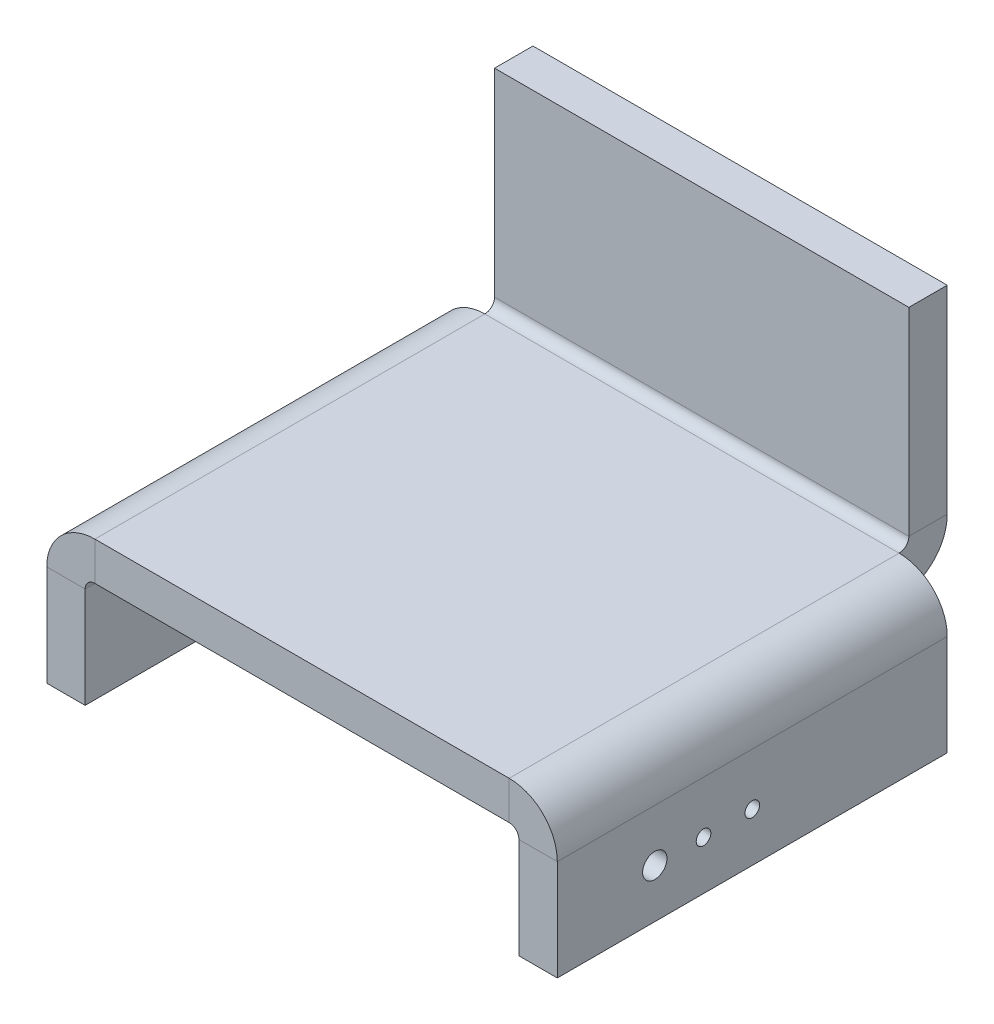
ISO-10303-21;
HEADER;
FILE_DESCRIPTION(('STEP AP214'),'2;1');
FILE_NAME('part.step','',(''),(''),'','','');
FILE_SCHEMA(('AUTOMOTIVE_DESIGN { 1 0 10303 214 1 1 1 1 }'));
ENDSEC;
DATA;
#1=APPLICATION_CONTEXT('core data for automotive mechanical design processes');
#2=APPLICATION_PROTOCOL_DEFINITION('international standard','automotive_design',2000,#1);
#3=PRODUCT_CONTEXT('',#1,'mechanical');
#4=PRODUCT('Part','Part','',(#3));
#5=PRODUCT_RELATED_PRODUCT_CATEGORY('part','',(#4));
#6=PRODUCT_DEFINITION_FORMATION('','',#4);
#7=PRODUCT_DEFINITION_CONTEXT('part definition',#1,'design');
#8=PRODUCT_DEFINITION('design','',#6,#7);
#9=PRODUCT_DEFINITION_SHAPE('','',#8);
#10=(LENGTH_UNIT() NAMED_UNIT(*) SI_UNIT(.MILLI.,.METRE.));
#11=(NAMED_UNIT(*) PLANE_ANGLE_UNIT() SI_UNIT($,.RADIAN.));
#12=(NAMED_UNIT(*) SI_UNIT($,.STERADIAN.) SOLID_ANGLE_UNIT());
#13=UNCERTAINTY_MEASURE_WITH_UNIT(LENGTH_MEASURE(1.E-05),#10,'distance_accuracy_value','');
#14=(GEOMETRIC_REPRESENTATION_CONTEXT(3) GLOBAL_UNCERTAINTY_ASSIGNED_CONTEXT((#13)) GLOBAL_UNIT_ASSIGNED_CONTEXT((#10,
#11,#12)) REPRESENTATION_CONTEXT('',''));
#15=CARTESIAN_POINT('',(0.,0.,0.));
#16=DIRECTION('',(0.,0.,1.));
#17=DIRECTION('',(1.,0.,0.));
#18=AXIS2_PLACEMENT_3D('',#15,#16,#17);
#19=CARTESIAN_POINT('',(0.,-7.6378,0.));
#20=DIRECTION('',(0.,-1.,0.));
#21=DIRECTION('',(0.,0.,-1.));
#22=AXIS2_PLACEMENT_3D('',#19,#20,#21);
#23=PLANE('',#22);
#24=DIRECTION('',(0.,0.,1.));
#25=VECTOR('',#24,1.);
#26=CARTESIAN_POINT('',(38.1,-7.6378,0.));
#27=LINE('',#26,#25);
#28=CARTESIAN_POINT('',(38.1,-7.6378,-101.6));
#29=VERTEX_POINT('',#28);
#30=CARTESIAN_POINT('',(38.1,-7.6378,0.));
#31=VERTEX_POINT('',#30);
#32=EDGE_CURVE('E65',#29,#31,#27,.T.);
#33=ORIENTED_EDGE('',*,*,#32,.F.);
#34=DIRECTION('',(1.,0.,0.));
#35=VECTOR('',#34,1.);
#36=CARTESIAN_POINT('',(0.,-7.6378,-101.6));
#37=LINE('',#36,#35);
#38=CARTESIAN_POINT('',(146.05,-7.6378,-101.6));
#39=VERTEX_POINT('',#38);
#40=EDGE_CURVE('E57',#29,#39,#37,.T.);
#41=ORIENTED_EDGE('',*,*,#40,.T.);
#42=DIRECTION('',(0.,0.,1.));
#43=VECTOR('',#42,1.);
#44=CARTESIAN_POINT('',(146.05,-7.6378,0.));
#45=LINE('',#44,#43);
#46=CARTESIAN_POINT('',(146.05,-7.6378,0.));
#47=VERTEX_POINT('',#46);
#48=EDGE_CURVE('E309',#39,#47,#45,.T.);
#49=ORIENTED_EDGE('',*,*,#48,.T.);
#50=DIRECTION('',(1.,0.,0.));
#51=VECTOR('',#50,1.);
#52=CARTESIAN_POINT('',(0.,-7.6378,0.));
#53=LINE('',#52,#51);
#54=EDGE_CURVE('E290',#31,#47,#53,.T.);
#55=ORIENTED_EDGE('',*,*,#54,.F.);
#56=EDGE_LOOP('',(#33,#41,#49,#55));
#57=FACE_BOUND('',#56,.T.);
#58=ADVANCED_FACE('F49',(#57),#23,.T.);
#59=CARTESIAN_POINT('',(0.,2.3622,0.));
#60=DIRECTION('',(0.,0.,-1.));
#61=DIRECTION('',(1.,0.,0.));
#62=AXIS2_PLACEMENT_3D('',#59,#60,#61);
#63=PLANE('',#62);
#64=ORIENTED_EDGE('',*,*,#54,.T.);
#65=DIRECTION('',(0.,1.,0.));
#66=VECTOR('',#65,1.);
#67=CARTESIAN_POINT('',(146.05,2.3622,0.));
#68=LINE('',#67,#66);
#69=CARTESIAN_POINT('',(146.05,2.3622,0.));
#70=VERTEX_POINT('',#69);
#71=EDGE_CURVE('E306',#47,#70,#68,.T.);
#72=ORIENTED_EDGE('',*,*,#71,.T.);
#73=DIRECTION('',(1.,0.,0.));
#74=VECTOR('',#73,1.);
#75=CARTESIAN_POINT('',(0.,2.3622,0.));
#76=LINE('',#75,#74);
#77=CARTESIAN_POINT('',(38.1,2.3622,0.));
#78=VERTEX_POINT('',#77);
#79=EDGE_CURVE('E298',#78,#70,#76,.T.);
#80=ORIENTED_EDGE('',*,*,#79,.F.);
#81=DIRECTION('',(0.,1.,0.));
#82=VECTOR('',#81,1.);
#83=CARTESIAN_POINT('',(38.1,2.3622,0.));
#84=LINE('',#83,#82);
#85=EDGE_CURVE('E300',#31,#78,#84,.T.);
#86=ORIENTED_EDGE('',*,*,#85,.F.);
#87=EDGE_LOOP('',(#64,#72,#80,#86));
#88=FACE_BOUND('',#87,.T.);
#89=ADVANCED_FACE('F430',(#88),#63,.F.);
#90=CARTESIAN_POINT('',(0.,2.3622,0.));
#91=DIRECTION('',(0.,-1.,0.));
#92=DIRECTION('',(0.,0.,-1.));
#93=AXIS2_PLACEMENT_3D('',#90,#91,#92);
#94=PLANE('',#93);
#95=DIRECTION('',(1.,0.,0.));
#96=VECTOR('',#95,1.);
#97=CARTESIAN_POINT('',(0.,2.3622,-101.6));
#98=LINE('',#97,#96);
#99=CARTESIAN_POINT('',(38.1,2.3622,-101.6));
#100=VERTEX_POINT('',#99);
#101=CARTESIAN_POINT('',(146.05,2.3622,-101.6));
#102=VERTEX_POINT('',#101);
#103=EDGE_CURVE('E312',#100,#102,#98,.T.);
#104=ORIENTED_EDGE('',*,*,#103,.F.);
#105=DIRECTION('',(0.,0.,1.));
#106=VECTOR('',#105,1.);
#107=CARTESIAN_POINT('',(38.1,2.3622,0.));
#108=LINE('',#107,#106);
#109=EDGE_CURVE('E295',#100,#78,#108,.T.);
#110=ORIENTED_EDGE('',*,*,#109,.T.);
#111=ORIENTED_EDGE('',*,*,#79,.T.);
#112=DIRECTION('',(0.,0.,1.));
#113=VECTOR('',#112,1.);
#114=CARTESIAN_POINT('',(146.05,2.3622,0.));
#115=LINE('',#114,#113);
#116=EDGE_CURVE('E303',#102,#70,#115,.T.);
#117=ORIENTED_EDGE('',*,*,#116,.F.);
#118=EDGE_LOOP('',(#104,#110,#111,#117));
#119=FACE_BOUND('',#118,.T.);
#120=ADVANCED_FACE('F391',(#119),#94,.F.);
#121=CARTESIAN_POINT('',(38.1,-10.1778,-101.6));
#122=DIRECTION('',(0.,0.,-1.));
#123=DIRECTION('',(-1.,0.,0.));
#124=AXIS2_PLACEMENT_3D('',#121,#122,#123);
#125=PLANE('',#124);
#126=DIRECTION('',(0.,1.,0.));
#127=VECTOR('',#126,1.);
#128=CARTESIAN_POINT('',(38.1,2.3622,-101.6));
#129=LINE('',#128,#127);
#130=EDGE_CURVE('E12',#29,#100,#129,.T.);
#131=ORIENTED_EDGE('',*,*,#130,.F.);
#132=CARTESIAN_POINT('',(38.1,-10.1778,-101.6));
#133=DIRECTION('',(0.,0.,1.));
#134=DIRECTION('',(1.,0.,0.));
#135=AXIS2_PLACEMENT_3D('',#132,#133,#134);
#136=CIRCLE('',#135,2.54);
#137=CARTESIAN_POINT('',(35.56,-10.1778,-101.6));
#138=VERTEX_POINT('',#137);
#139=EDGE_CURVE('E254',#29,#138,#136,.T.);
#140=ORIENTED_EDGE('',*,*,#139,.T.);
#141=DIRECTION('',(1.,0.,0.));
#142=VECTOR('',#141,1.);
#143=CARTESIAN_POINT('',(25.56,-10.1778,-101.6));
#144=LINE('',#143,#142);
#145=CARTESIAN_POINT('',(25.56,-10.1778,-101.6));
#146=VERTEX_POINT('',#145);
#147=EDGE_CURVE('E265',#146,#138,#144,.T.);
#148=ORIENTED_EDGE('',*,*,#147,.F.);
#149=CARTESIAN_POINT('',(38.1,-10.1778,-101.6));
#150=DIRECTION('',(0.,0.,1.));
#151=DIRECTION('',(1.,0.,0.));
#152=AXIS2_PLACEMENT_3D('',#149,#150,#151);
#153=CIRCLE('',#152,12.54);
#154=EDGE_CURVE('E283',#100,#146,#153,.T.);
#155=ORIENTED_EDGE('',*,*,#154,.F.);
#156=EDGE_LOOP('',(#131,#140,#148,#155));
#157=FACE_BOUND('',#156,.T.);
#158=ADVANCED_FACE('F378',(#157),#125,.T.);
#159=CARTESIAN_POINT('',(38.1,-10.1778,0.));
#160=DIRECTION('',(0.,0.,1.));
#161=DIRECTION('',(1.,0.,0.));
#162=AXIS2_PLACEMENT_3D('',#159,#160,#161);
#163=PLANE('',#162);
#164=DIRECTION('',(-1.,0.,0.));
#165=VECTOR('',#164,1.);
#166=CARTESIAN_POINT('',(25.56,-10.1778,0.));
#167=LINE('',#166,#165);
#168=CARTESIAN_POINT('',(35.56,-10.1778,0.));
#169=VERTEX_POINT('',#168);
#170=CARTESIAN_POINT('',(25.56,-10.1778,0.));
#171=VERTEX_POINT('',#170);
#172=EDGE_CURVE('E252',#169,#171,#167,.T.);
#173=ORIENTED_EDGE('',*,*,#172,.F.);
#174=CARTESIAN_POINT('',(38.1,-10.1778,0.));
#175=DIRECTION('',(0.,0.,1.));
#176=DIRECTION('',(1.,0.,0.));
#177=AXIS2_PLACEMENT_3D('',#174,#175,#176);
#178=CIRCLE('',#177,2.54);
#179=EDGE_CURVE('E287',#169,#31,#178,.F.);
#180=ORIENTED_EDGE('',*,*,#179,.T.);
#181=ORIENTED_EDGE('',*,*,#85,.T.);
#182=CARTESIAN_POINT('',(38.1,-10.1778,0.));
#183=DIRECTION('',(0.,0.,-1.));
#184=DIRECTION('',(-1.,0.,0.));
#185=AXIS2_PLACEMENT_3D('',#182,#183,#184);
#186=CIRCLE('',#185,12.54);
#187=EDGE_CURVE('E286',#171,#78,#186,.T.);
#188=ORIENTED_EDGE('',*,*,#187,.F.);
#189=EDGE_LOOP('',(#173,#180,#181,#188));
#190=FACE_BOUND('',#189,.T.);
#191=ADVANCED_FACE('F442',(#190),#163,.T.);
#192=CARTESIAN_POINT('',(38.1,-10.1778,-153.57565713919));
#193=DIRECTION('',(0.,0.,1.));
#194=DIRECTION('',(1.,0.,0.));
#195=AXIS2_PLACEMENT_3D('',#192,#193,#194);
#196=CYLINDRICAL_SURFACE('',#195,12.54);
#197=ORIENTED_EDGE('',*,*,#187,.T.);
#198=ORIENTED_EDGE('',*,*,#109,.F.);
#199=ORIENTED_EDGE('',*,*,#154,.T.);
#200=DIRECTION('',(0.,0.,1.));
#201=VECTOR('',#200,1.);
#202=CARTESIAN_POINT('',(25.56,-10.1778,0.));
#203=LINE('',#202,#201);
#204=EDGE_CURVE('E248',#146,#171,#203,.T.);
#205=ORIENTED_EDGE('',*,*,#204,.T.);
#206=EDGE_LOOP('',(#197,#198,#199,#205));
#207=FACE_BOUND('',#206,.T.);
#208=ADVANCED_FACE('F445',(#207),#196,.T.);
#209=CARTESIAN_POINT('',(38.1,-10.1778,-153.57565713919));
#210=DIRECTION('',(0.,0.,1.));
#211=DIRECTION('',(1.,0.,0.));
#212=AXIS2_PLACEMENT_3D('',#209,#210,#211);
#213=CYLINDRICAL_SURFACE('',#212,2.54);
#214=ORIENTED_EDGE('',*,*,#179,.F.);
#215=DIRECTION('',(0.,0.,1.));
#216=VECTOR('',#215,1.);
#217=CARTESIAN_POINT('',(35.56,-10.1778,0.));
#218=LINE('',#217,#216);
#219=EDGE_CURVE('E257',#138,#169,#218,.T.);
#220=ORIENTED_EDGE('',*,*,#219,.F.);
#221=ORIENTED_EDGE('',*,*,#139,.F.);
#222=ORIENTED_EDGE('',*,*,#32,.T.);
#223=EDGE_LOOP('',(#214,#220,#221,#222));
#224=FACE_BOUND('',#223,.T.);
#225=ADVANCED_FACE('F447',(#224),#213,.F.);
#226=CARTESIAN_POINT('',(25.5600000000001,-36.4339956959665,0.));
#227=DIRECTION('',(0.,1.,0.));
#228=DIRECTION('',(0.,0.,1.));
#229=AXIS2_PLACEMENT_3D('',#226,#227,#228);
#230=PLANE('',#229);
#231=DIRECTION('',(-1.,0.,0.));
#232=VECTOR('',#231,1.);
#233=CARTESIAN_POINT('',(25.5600000000001,-36.4339956959665,-101.6));
#234=LINE('',#233,#232);
#235=CARTESIAN_POINT('',(35.5600000000001,-36.4339956959665,-101.6));
#236=VERTEX_POINT('',#235);
#237=CARTESIAN_POINT('',(25.5600000000001,-36.4339956959665,-101.6));
#238=VERTEX_POINT('',#237);
#239=EDGE_CURVE('E260',#236,#238,#234,.T.);
#240=ORIENTED_EDGE('',*,*,#239,.F.);
#241=DIRECTION('',(0.,0.,-1.));
#242=VECTOR('',#241,1.);
#243=CARTESIAN_POINT('',(35.5600000000001,-36.4339956959665,0.));
#244=LINE('',#243,#242);
#245=CARTESIAN_POINT('',(35.5600000000001,-36.4339956959665,0.));
#246=VERTEX_POINT('',#245);
#247=EDGE_CURVE('E278',#236,#246,#244,.F.);
#248=ORIENTED_EDGE('',*,*,#247,.T.);
#249=DIRECTION('',(-1.,0.,0.));
#250=VECTOR('',#249,1.);
#251=CARTESIAN_POINT('',(25.5600000000001,-36.4339956959665,0.));
#252=LINE('',#251,#250);
#253=CARTESIAN_POINT('',(25.5600000000001,-36.4339956959665,0.));
#254=VERTEX_POINT('',#253);
#255=EDGE_CURVE('E276',#246,#254,#252,.T.);
#256=ORIENTED_EDGE('',*,*,#255,.T.);
#257=DIRECTION('',(0.,0.,1.));
#258=VECTOR('',#257,1.);
#259=CARTESIAN_POINT('',(25.5600000000001,-36.4339956959665,0.));
#260=LINE('',#259,#258);
#261=EDGE_CURVE('E271',#238,#254,#260,.T.);
#262=ORIENTED_EDGE('',*,*,#261,.F.);
#263=EDGE_LOOP('',(#240,#248,#256,#262));
#264=FACE_BOUND('',#263,.T.);
#265=ADVANCED_FACE('F450',(#264),#230,.F.);
#266=CARTESIAN_POINT('',(25.5600000000001,-36.4339956959665,0.));
#267=DIRECTION('',(1.,0.,0.));
#268=DIRECTION('',(0.,0.,-1.));
#269=AXIS2_PLACEMENT_3D('',#266,#267,#268);
#270=PLANE('',#269);
#271=CARTESIAN_POINT('',(25.5599999999997,-23.7339956959661,-38.1));
#272=DIRECTION('',(1.,0.,0.));
#273=DIRECTION('',(0.,1.,0.));
#274=AXIS2_PLACEMENT_3D('',#271,#272,#273);
#275=CIRCLE('',#274,1.905);
#276=CARTESIAN_POINT('',(25.5599999999997,-21.8289956959661,-38.1));
#277=VERTEX_POINT('',#276);
#278=EDGE_CURVE('E326',#277,#277,#275,.T.);
#279=ORIENTED_EDGE('',*,*,#278,.T.);
#280=EDGE_LOOP('',(#279));
#281=FACE_BOUND('',#280,.T.);
#282=CARTESIAN_POINT('',(25.5599999999997,-23.7339956959661,-50.8));
#283=DIRECTION('',(1.,0.,0.));
#284=DIRECTION('',(0.,1.,0.));
#285=AXIS2_PLACEMENT_3D('',#282,#283,#284);
#286=CIRCLE('',#285,1.905);
#287=CARTESIAN_POINT('',(25.5599999999997,-21.8289956959661,-50.8));
#288=VERTEX_POINT('',#287);
#289=EDGE_CURVE('E337',#288,#288,#286,.T.);
#290=ORIENTED_EDGE('',*,*,#289,.T.);
#291=EDGE_LOOP('',(#290));
#292=FACE_BOUND('',#291,.T.);
#293=CARTESIAN_POINT('',(25.5599999999997,-23.7339956959661,-25.4));
#294=DIRECTION('',(1.,0.,0.));
#295=DIRECTION('',(0.,1.,0.));
#296=AXIS2_PLACEMENT_3D('',#293,#294,#295);
#297=CIRCLE('',#296,3.175);
#298=CARTESIAN_POINT('',(25.5599999999997,-20.5589956959661,-25.4));
#299=VERTEX_POINT('',#298);
#300=EDGE_CURVE('E322',#299,#299,#297,.T.);
#301=ORIENTED_EDGE('',*,*,#300,.T.);
#302=EDGE_LOOP('',(#301));
#303=FACE_BOUND('',#302,.T.);
#304=ORIENTED_EDGE('',*,*,#204,.F.);
#305=DIRECTION('',(0.,-1.,0.));
#306=VECTOR('',#305,1.);
#307=CARTESIAN_POINT('',(25.5600000000001,-36.4339956959665,-101.6));
#308=LINE('',#307,#306);
#309=EDGE_CURVE('E274',#146,#238,#308,.T.);
#310=ORIENTED_EDGE('',*,*,#309,.T.);
#311=ORIENTED_EDGE('',*,*,#261,.T.);
#312=DIRECTION('',(0.,1.,0.));
#313=VECTOR('',#312,1.);
#314=CARTESIAN_POINT('',(25.5600000000001,-36.4339956959665,0.));
#315=LINE('',#314,#313);
#316=EDGE_CURVE('E268',#254,#171,#315,.T.);
#317=ORIENTED_EDGE('',*,*,#316,.T.);
#318=EDGE_LOOP('',(#304,#310,#311,#317));
#319=FACE_BOUND('',#318,.T.);
#320=ADVANCED_FACE('F466',(#281,#292,#303,#319),#270,.F.);
#321=CARTESIAN_POINT('',(25.5600000000001,-36.4339956959665,-101.6));
#322=DIRECTION('',(0.,0.,1.));
#323=DIRECTION('',(0.,-1.,0.));
#324=AXIS2_PLACEMENT_3D('',#321,#322,#323);
#325=PLANE('',#324);
#326=ORIENTED_EDGE('',*,*,#309,.F.);
#327=ORIENTED_EDGE('',*,*,#147,.T.);
#328=DIRECTION('',(0.,1.,0.));
#329=VECTOR('',#328,1.);
#330=CARTESIAN_POINT('',(35.5600000000001,-36.4339956959665,-101.6));
#331=LINE('',#330,#329);
#332=EDGE_CURVE('E263',#138,#236,#331,.F.);
#333=ORIENTED_EDGE('',*,*,#332,.T.);
#334=ORIENTED_EDGE('',*,*,#239,.T.);
#335=EDGE_LOOP('',(#326,#327,#333,#334));
#336=FACE_BOUND('',#335,.T.);
#337=ADVANCED_FACE('F462',(#336),#325,.F.);
#338=CARTESIAN_POINT('',(35.5600000000001,-36.4339956959665,0.));
#339=DIRECTION('',(1.,0.,0.));
#340=DIRECTION('',(0.,0.,-1.));
#341=AXIS2_PLACEMENT_3D('',#338,#339,#340);
#342=PLANE('',#341);
#343=CARTESIAN_POINT('',(35.5600000000001,-23.7339956959661,-38.1));
#344=DIRECTION('',(1.,0.,0.));
#345=DIRECTION('',(0.,1.,0.));
#346=AXIS2_PLACEMENT_3D('',#343,#344,#345);
#347=CIRCLE('',#346,1.905);
#348=CARTESIAN_POINT('',(35.56,-21.8289956959661,-38.1));
#349=VERTEX_POINT('',#348);
#350=EDGE_CURVE('E345',#349,#349,#347,.T.);
#351=ORIENTED_EDGE('',*,*,#350,.F.);
#352=EDGE_LOOP('',(#351));
#353=FACE_BOUND('',#352,.T.);
#354=CARTESIAN_POINT('',(35.5600000000001,-23.7339956959661,-50.8));
#355=DIRECTION('',(1.,0.,0.));
#356=DIRECTION('',(0.,1.,0.));
#357=AXIS2_PLACEMENT_3D('',#354,#355,#356);
#358=CIRCLE('',#357,1.905);
#359=CARTESIAN_POINT('',(35.56,-21.8289956959661,-50.8));
#360=VERTEX_POINT('',#359);
#361=EDGE_CURVE('E325',#360,#360,#358,.T.);
#362=ORIENTED_EDGE('',*,*,#361,.F.);
#363=EDGE_LOOP('',(#362));
#364=FACE_BOUND('',#363,.T.);
#365=CARTESIAN_POINT('',(35.5600000000001,-23.7339956959661,-25.4));
#366=DIRECTION('',(1.,0.,0.));
#367=DIRECTION('',(0.,1.,0.));
#368=AXIS2_PLACEMENT_3D('',#365,#366,#367);
#369=CIRCLE('',#368,3.175);
#370=CARTESIAN_POINT('',(35.56,-20.5589956959661,-25.4));
#371=VERTEX_POINT('',#370);
#372=EDGE_CURVE('E199',#371,#371,#369,.T.);
#373=ORIENTED_EDGE('',*,*,#372,.F.);
#374=EDGE_LOOP('',(#373));
#375=FACE_BOUND('',#374,.T.);
#376=ORIENTED_EDGE('',*,*,#332,.F.);
#377=ORIENTED_EDGE('',*,*,#219,.T.);
#378=DIRECTION('',(0.,1.,0.));
#379=VECTOR('',#378,1.);
#380=CARTESIAN_POINT('',(35.5600000000001,-36.4339956959665,0.));
#381=LINE('',#380,#379);
#382=EDGE_CURVE('E255',#246,#169,#381,.T.);
#383=ORIENTED_EDGE('',*,*,#382,.F.);
#384=ORIENTED_EDGE('',*,*,#247,.F.);
#385=EDGE_LOOP('',(#376,#377,#383,#384));
#386=FACE_BOUND('',#385,.T.);
#387=ADVANCED_FACE('F458',(#353,#364,#375,#386),#342,.T.);
#388=CARTESIAN_POINT('',(25.5600000000001,-36.4339956959665,0.));
#389=DIRECTION('',(0.,0.,-1.));
#390=DIRECTION('',(0.,1.,0.));
#391=AXIS2_PLACEMENT_3D('',#388,#389,#390);
#392=PLANE('',#391);
#393=ORIENTED_EDGE('',*,*,#382,.T.);
#394=ORIENTED_EDGE('',*,*,#172,.T.);
#395=ORIENTED_EDGE('',*,*,#316,.F.);
#396=ORIENTED_EDGE('',*,*,#255,.F.);
#397=EDGE_LOOP('',(#393,#394,#395,#396));
#398=FACE_BOUND('',#397,.T.);
#399=ADVANCED_FACE('F455',(#398),#392,.F.);
#400=CARTESIAN_POINT('',(146.05,-10.1778,-101.6));
#401=DIRECTION('',(0.,0.,-1.));
#402=DIRECTION('',(-1.,0.,0.));
#403=AXIS2_PLACEMENT_3D('',#400,#401,#402);
#404=PLANE('',#403);
#405=DIRECTION('',(-1.,0.,0.));
#406=VECTOR('',#405,1.);
#407=CARTESIAN_POINT('',(158.59,-10.1778,-101.6));
#408=LINE('',#407,#406);
#409=CARTESIAN_POINT('',(158.59,-10.1778,-101.6));
#410=VERTEX_POINT('',#409);
#411=CARTESIAN_POINT('',(148.59,-10.1778,-101.6));
#412=VERTEX_POINT('',#411);
#413=EDGE_CURVE('E207',#410,#412,#408,.T.);
#414=ORIENTED_EDGE('',*,*,#413,.T.);
#415=CARTESIAN_POINT('',(146.05,-10.1778,-101.6));
#416=DIRECTION('',(0.,0.,-1.));
#417=DIRECTION('',(-1.,0.,0.));
#418=AXIS2_PLACEMENT_3D('',#415,#416,#417);
#419=CIRCLE('',#418,2.54);
#420=EDGE_CURVE('E73',#412,#39,#419,.F.);
#421=ORIENTED_EDGE('',*,*,#420,.T.);
#422=DIRECTION('',(0.,1.,0.));
#423=VECTOR('',#422,1.);
#424=CARTESIAN_POINT('',(146.05,2.3622,-101.6));
#425=LINE('',#424,#423);
#426=EDGE_CURVE('E317',#39,#102,#425,.T.);
#427=ORIENTED_EDGE('',*,*,#426,.T.);
#428=CARTESIAN_POINT('',(146.05,-10.1778,-101.6));
#429=DIRECTION('',(0.,0.,1.));
#430=DIRECTION('',(1.,0.,0.));
#431=AXIS2_PLACEMENT_3D('',#428,#429,#430);
#432=CIRCLE('',#431,12.54);
#433=EDGE_CURVE('E241',#410,#102,#432,.T.);
#434=ORIENTED_EDGE('',*,*,#433,.F.);
#435=EDGE_LOOP('',(#414,#421,#427,#434));
#436=FACE_BOUND('',#435,.T.);
#437=ADVANCED_FACE('F389',(#436),#404,.T.);
#438=CARTESIAN_POINT('',(146.05,-10.1778,0.));
#439=DIRECTION('',(0.,0.,1.));
#440=DIRECTION('',(1.,0.,0.));
#441=AXIS2_PLACEMENT_3D('',#438,#439,#440);
#442=PLANE('',#441);
#443=CARTESIAN_POINT('',(146.05,-10.1778,0.));
#444=DIRECTION('',(0.,0.,-1.));
#445=DIRECTION('',(-1.,0.,0.));
#446=AXIS2_PLACEMENT_3D('',#443,#444,#445);
#447=CIRCLE('',#446,2.54);
#448=CARTESIAN_POINT('',(148.59,-10.1778,0.));
#449=VERTEX_POINT('',#448);
#450=EDGE_CURVE('E245',#47,#449,#447,.T.);
#451=ORIENTED_EDGE('',*,*,#450,.T.);
#452=DIRECTION('',(1.,0.,0.));
#453=VECTOR('',#452,1.);
#454=CARTESIAN_POINT('',(158.59,-10.1778,0.));
#455=LINE('',#454,#453);
#456=CARTESIAN_POINT('',(158.59,-10.1778,0.));
#457=VERTEX_POINT('',#456);
#458=EDGE_CURVE('E234',#449,#457,#455,.T.);
#459=ORIENTED_EDGE('',*,*,#458,.T.);
#460=CARTESIAN_POINT('',(146.05,-10.1778,0.));
#461=DIRECTION('',(0.,0.,-1.));
#462=DIRECTION('',(-1.,0.,0.));
#463=AXIS2_PLACEMENT_3D('',#460,#461,#462);
#464=CIRCLE('',#463,12.54);
#465=EDGE_CURVE('E244',#70,#457,#464,.T.);
#466=ORIENTED_EDGE('',*,*,#465,.F.);
#467=ORIENTED_EDGE('',*,*,#71,.F.);
#468=EDGE_LOOP('',(#451,#459,#466,#467));
#469=FACE_BOUND('',#468,.T.);
#470=ADVANCED_FACE('F406',(#469),#442,.T.);
#471=CARTESIAN_POINT('',(146.05,-10.1778,51.9756571391896));
#472=DIRECTION('',(0.,0.,-1.));
#473=DIRECTION('',(-1.,0.,0.));
#474=AXIS2_PLACEMENT_3D('',#471,#472,#473);
#475=CYLINDRICAL_SURFACE('',#474,12.54);
#476=ORIENTED_EDGE('',*,*,#116,.T.);
#477=ORIENTED_EDGE('',*,*,#465,.T.);
#478=DIRECTION('',(0.,0.,1.));
#479=VECTOR('',#478,1.);
#480=CARTESIAN_POINT('',(158.59,-10.1778,0.));
#481=LINE('',#480,#479);
#482=EDGE_CURVE('E224',#410,#457,#481,.T.);
#483=ORIENTED_EDGE('',*,*,#482,.F.);
#484=ORIENTED_EDGE('',*,*,#433,.T.);
#485=EDGE_LOOP('',(#476,#477,#483,#484));
#486=FACE_BOUND('',#485,.T.);
#487=ADVANCED_FACE('F395',(#486),#475,.T.);
#488=CARTESIAN_POINT('',(146.05,-10.1778,51.9756571391896));
#489=DIRECTION('',(0.,0.,-1.));
#490=DIRECTION('',(-1.,0.,0.));
#491=AXIS2_PLACEMENT_3D('',#488,#489,#490);
#492=CYLINDRICAL_SURFACE('',#491,2.54);
#493=ORIENTED_EDGE('',*,*,#48,.F.);
#494=ORIENTED_EDGE('',*,*,#420,.F.);
#495=DIRECTION('',(0.,0.,1.));
#496=VECTOR('',#495,1.);
#497=CARTESIAN_POINT('',(148.59,-10.1778,0.));
#498=LINE('',#497,#496);
#499=EDGE_CURVE('E237',#412,#449,#498,.T.);
#500=ORIENTED_EDGE('',*,*,#499,.T.);
#501=ORIENTED_EDGE('',*,*,#450,.F.);
#502=EDGE_LOOP('',(#493,#494,#500,#501));
#503=FACE_BOUND('',#502,.T.);
#504=ADVANCED_FACE('F409',(#503),#492,.F.);
#505=CARTESIAN_POINT('',(158.59,-36.4339956959665,0.));
#506=DIRECTION('',(0.,1.,0.));
#507=DIRECTION('',(0.,0.,-1.));
#508=AXIS2_PLACEMENT_3D('',#505,#506,#507);
#509=PLANE('',#508);
#510=DIRECTION('',(1.,0.,0.));
#511=VECTOR('',#510,1.);
#512=CARTESIAN_POINT('',(158.59,-36.4339956959665,0.));
#513=LINE('',#512,#511);
#514=CARTESIAN_POINT('',(148.59,-36.4339956959665,0.));
#515=VERTEX_POINT('',#514);
#516=CARTESIAN_POINT('',(158.59,-36.4339956959665,0.));
#517=VERTEX_POINT('',#516);
#518=EDGE_CURVE('E214',#515,#517,#513,.T.);
#519=ORIENTED_EDGE('',*,*,#518,.F.);
#520=DIRECTION('',(0.,0.,-1.));
#521=VECTOR('',#520,1.);
#522=CARTESIAN_POINT('',(148.59,-36.4339956959665,0.));
#523=LINE('',#522,#521);
#524=CARTESIAN_POINT('',(148.59,-36.4339956959665,-101.6));
#525=VERTEX_POINT('',#524);
#526=EDGE_CURVE('E231',#515,#525,#523,.T.);
#527=ORIENTED_EDGE('',*,*,#526,.T.);
#528=DIRECTION('',(1.,0.,0.));
#529=VECTOR('',#528,1.);
#530=CARTESIAN_POINT('',(158.59,-36.4339956959665,-101.6));
#531=LINE('',#530,#529);
#532=CARTESIAN_POINT('',(158.59,-36.4339956959665,-101.6));
#533=VERTEX_POINT('',#532);
#534=EDGE_CURVE('E229',#525,#533,#531,.T.);
#535=ORIENTED_EDGE('',*,*,#534,.T.);
#536=DIRECTION('',(0.,0.,-1.));
#537=VECTOR('',#536,1.);
#538=CARTESIAN_POINT('',(158.59,-36.4339956959665,0.));
#539=LINE('',#538,#537);
#540=EDGE_CURVE('E219',#517,#533,#539,.T.);
#541=ORIENTED_EDGE('',*,*,#540,.F.);
#542=EDGE_LOOP('',(#519,#527,#535,#541));
#543=FACE_BOUND('',#542,.T.);
#544=ADVANCED_FACE('F418',(#543),#509,.F.);
#545=CARTESIAN_POINT('',(158.590000000001,147.716004304033,0.));
#546=DIRECTION('',(-1.,0.,0.));
#547=DIRECTION('',(0.,0.,-1.));
#548=AXIS2_PLACEMENT_3D('',#545,#546,#547);
#549=PLANE('',#548);
#550=CARTESIAN_POINT('',(158.59,-23.7339956959665,-38.1));
#551=DIRECTION('',(1.,0.,0.));
#552=DIRECTION('',(0.,1.,0.));
#553=AXIS2_PLACEMENT_3D('',#550,#551,#552);
#554=CIRCLE('',#553,1.905);
#555=CARTESIAN_POINT('',(158.59,-21.8289956959665,-38.1));
#556=VERTEX_POINT('',#555);
#557=EDGE_CURVE('E332',#556,#556,#554,.T.);
#558=ORIENTED_EDGE('',*,*,#557,.F.);
#559=EDGE_LOOP('',(#558));
#560=FACE_BOUND('',#559,.T.);
#561=CARTESIAN_POINT('',(158.59,-23.7339956959665,-50.8));
#562=DIRECTION('',(1.,0.,0.));
#563=DIRECTION('',(0.,1.,0.));
#564=AXIS2_PLACEMENT_3D('',#561,#562,#563);
#565=CIRCLE('',#564,1.905);
#566=CARTESIAN_POINT('',(158.59,-21.8289956959665,-50.8));
#567=VERTEX_POINT('',#566);
#568=EDGE_CURVE('E342',#567,#567,#565,.T.);
#569=ORIENTED_EDGE('',*,*,#568,.F.);
#570=EDGE_LOOP('',(#569));
#571=FACE_BOUND('',#570,.T.);
#572=CARTESIAN_POINT('',(158.59,-23.7339956959665,-25.4));
#573=DIRECTION('',(1.,0.,0.));
#574=DIRECTION('',(0.,1.,0.));
#575=AXIS2_PLACEMENT_3D('',#572,#573,#574);
#576=CIRCLE('',#575,3.175);
#577=CARTESIAN_POINT('',(158.59,-20.5589956959665,-25.4));
#578=VERTEX_POINT('',#577);
#579=EDGE_CURVE('E348',#578,#578,#576,.T.);
#580=ORIENTED_EDGE('',*,*,#579,.F.);
#581=EDGE_LOOP('',(#580));
#582=FACE_BOUND('',#581,.T.);
#583=DIRECTION('',(0.,1.,0.));
#584=VECTOR('',#583,1.);
#585=CARTESIAN_POINT('',(158.59,1.66600430403349,-101.6));
#586=LINE('',#585,#584);
#587=EDGE_CURVE('E226',#533,#410,#586,.T.);
#588=ORIENTED_EDGE('',*,*,#587,.T.);
#589=ORIENTED_EDGE('',*,*,#482,.T.);
#590=DIRECTION('',(0.,-1.,0.));
#591=VECTOR('',#590,1.);
#592=CARTESIAN_POINT('',(158.590000000001,147.716004304033,0.));
#593=LINE('',#592,#591);
#594=EDGE_CURVE('E222',#457,#517,#593,.T.);
#595=ORIENTED_EDGE('',*,*,#594,.T.);
#596=ORIENTED_EDGE('',*,*,#540,.T.);
#597=EDGE_LOOP('',(#588,#589,#595,#596));
#598=FACE_BOUND('',#597,.T.);
#599=ADVANCED_FACE('F398',(#560,#571,#582,#598),#549,.F.);
#600=CARTESIAN_POINT('',(158.590000000001,147.716004304033,0.));
#601=DIRECTION('',(0.,0.,-1.));
#602=DIRECTION('',(0.,-1.,0.));
#603=AXIS2_PLACEMENT_3D('',#600,#601,#602);
#604=PLANE('',#603);
#605=ORIENTED_EDGE('',*,*,#458,.F.);
#606=DIRECTION('',(0.,-1.,0.));
#607=VECTOR('',#606,1.);
#608=CARTESIAN_POINT('',(148.59,147.716004304033,0.));
#609=LINE('',#608,#607);
#610=EDGE_CURVE('E217',#449,#515,#609,.T.);
#611=ORIENTED_EDGE('',*,*,#610,.T.);
#612=ORIENTED_EDGE('',*,*,#518,.T.);
#613=ORIENTED_EDGE('',*,*,#594,.F.);
#614=EDGE_LOOP('',(#605,#611,#612,#613));
#615=FACE_BOUND('',#614,.T.);
#616=ADVANCED_FACE('F402',(#615),#604,.F.);
#617=CARTESIAN_POINT('',(148.59,147.716004304033,0.));
#618=DIRECTION('',(-1.,0.,0.));
#619=DIRECTION('',(0.,0.,-1.));
#620=AXIS2_PLACEMENT_3D('',#617,#618,#619);
#621=PLANE('',#620);
#622=CARTESIAN_POINT('',(148.59,-23.7339956959665,-38.1));
#623=DIRECTION('',(-1.,0.,0.));
#624=DIRECTION('',(0.,-1.,0.));
#625=AXIS2_PLACEMENT_3D('',#622,#623,#624);
#626=CIRCLE('',#625,1.905);
#627=CARTESIAN_POINT('',(148.59,-25.6389956959665,-38.1));
#628=VERTEX_POINT('',#627);
#629=EDGE_CURVE('E52',#628,#628,#626,.T.);
#630=ORIENTED_EDGE('',*,*,#629,.F.);
#631=EDGE_LOOP('',(#630));
#632=FACE_BOUND('',#631,.T.);
#633=CARTESIAN_POINT('',(148.59,-23.7339956959665,-50.8));
#634=DIRECTION('',(-1.,0.,0.));
#635=DIRECTION('',(0.,-1.,0.));
#636=AXIS2_PLACEMENT_3D('',#633,#634,#635);
#637=CIRCLE('',#636,1.905);
#638=CARTESIAN_POINT('',(148.59,-25.6389956959665,-50.8));
#639=VERTEX_POINT('',#638);
#640=EDGE_CURVE('E323',#639,#639,#637,.T.);
#641=ORIENTED_EDGE('',*,*,#640,.F.);
#642=EDGE_LOOP('',(#641));
#643=FACE_BOUND('',#642,.T.);
#644=CARTESIAN_POINT('',(148.59,-23.7339956959665,-25.4));
#645=DIRECTION('',(-1.,0.,0.));
#646=DIRECTION('',(0.,-1.,0.));
#647=AXIS2_PLACEMENT_3D('',#644,#645,#646);
#648=CIRCLE('',#647,3.175);
#649=CARTESIAN_POINT('',(148.59,-26.9089956959665,-25.4));
#650=VERTEX_POINT('',#649);
#651=EDGE_CURVE('E320',#650,#650,#648,.T.);
#652=ORIENTED_EDGE('',*,*,#651,.F.);
#653=EDGE_LOOP('',(#652));
#654=FACE_BOUND('',#653,.T.);
#655=ORIENTED_EDGE('',*,*,#499,.F.);
#656=DIRECTION('',(0.,-1.,0.));
#657=VECTOR('',#656,1.);
#658=CARTESIAN_POINT('',(148.590000000001,147.716004304034,-101.6));
#659=LINE('',#658,#657);
#660=EDGE_CURVE('E212',#525,#412,#659,.F.);
#661=ORIENTED_EDGE('',*,*,#660,.F.);
#662=ORIENTED_EDGE('',*,*,#526,.F.);
#663=ORIENTED_EDGE('',*,*,#610,.F.);
#664=EDGE_LOOP('',(#655,#661,#662,#663));
#665=FACE_BOUND('',#664,.T.);
#666=ADVANCED_FACE('F413',(#632,#643,#654,#665),#621,.T.);
#667=CARTESIAN_POINT('',(158.59,1.66600430403349,-101.6));
#668=DIRECTION('',(0.,0.,1.));
#669=DIRECTION('',(0.,1.,0.));
#670=AXIS2_PLACEMENT_3D('',#667,#668,#669);
#671=PLANE('',#670);
#672=ORIENTED_EDGE('',*,*,#413,.F.);
#673=ORIENTED_EDGE('',*,*,#587,.F.);
#674=ORIENTED_EDGE('',*,*,#534,.F.);
#675=ORIENTED_EDGE('',*,*,#660,.T.);
#676=EDGE_LOOP('',(#672,#673,#674,#675));
#677=FACE_BOUND('',#676,.T.);
#678=ADVANCED_FACE('F416',(#677),#671,.F.);
#679=CARTESIAN_POINT('',(38.1,4.9022,-101.6));
#680=DIRECTION('',(1.,0.,0.));
#681=DIRECTION('',(0.,0.,-1.));
#682=AXIS2_PLACEMENT_3D('',#679,#680,#681);
#683=PLANE('',#682);
#684=DIRECTION('',(0.,0.,-1.));
#685=VECTOR('',#684,1.);
#686=CARTESIAN_POINT('',(38.1,4.90220000000001,-104.14));
#687=LINE('',#686,#685);
#688=CARTESIAN_POINT('',(38.1,4.90220000000001,-104.14));
#689=VERTEX_POINT('',#688);
#690=CARTESIAN_POINT('',(38.1,4.90220000000005,-114.14));
#691=VERTEX_POINT('',#690);
#692=EDGE_CURVE('E197',#689,#691,#687,.T.);
#693=ORIENTED_EDGE('',*,*,#692,.T.);
#694=CARTESIAN_POINT('',(38.1,4.9022,-101.6));
#695=DIRECTION('',(-1.,0.,0.));
#696=DIRECTION('',(0.,0.,1.));
#697=AXIS2_PLACEMENT_3D('',#694,#695,#696);
#698=CIRCLE('',#697,12.54);
#699=EDGE_CURVE('E184',#691,#29,#698,.T.);
#700=ORIENTED_EDGE('',*,*,#699,.T.);
#701=ORIENTED_EDGE('',*,*,#130,.T.);
#702=CARTESIAN_POINT('',(38.1,4.9022,-101.6));
#703=DIRECTION('',(-1.,0.,0.));
#704=DIRECTION('',(0.,0.,1.));
#705=AXIS2_PLACEMENT_3D('',#702,#703,#704);
#706=CIRCLE('',#705,2.54);
#707=EDGE_CURVE('E200',#689,#100,#706,.T.);
#708=ORIENTED_EDGE('',*,*,#707,.F.);
#709=EDGE_LOOP('',(#693,#700,#701,#708));
#710=FACE_BOUND('',#709,.T.);
#711=ADVANCED_FACE('F372',(#710),#683,.F.);
#712=CARTESIAN_POINT('',(146.05,4.9022,-101.6));
#713=DIRECTION('',(-1.,0.,0.));
#714=DIRECTION('',(0.,0.,1.));
#715=AXIS2_PLACEMENT_3D('',#712,#713,#714);
#716=PLANE('',#715);
#717=CARTESIAN_POINT('',(146.05,4.9022,-101.6));
#718=DIRECTION('',(-1.,0.,0.));
#719=DIRECTION('',(0.,0.,1.));
#720=AXIS2_PLACEMENT_3D('',#717,#718,#719);
#721=CIRCLE('',#720,12.54);
#722=CARTESIAN_POINT('',(146.05,4.90220000000005,-114.14));
#723=VERTEX_POINT('',#722);
#724=EDGE_CURVE('E204',#39,#723,#721,.F.);
#725=ORIENTED_EDGE('',*,*,#724,.T.);
#726=DIRECTION('',(0.,0.,1.));
#727=VECTOR('',#726,1.);
#728=CARTESIAN_POINT('',(146.05,4.90220000000001,-104.14));
#729=LINE('',#728,#727);
#730=CARTESIAN_POINT('',(146.05,4.90220000000001,-104.14));
#731=VERTEX_POINT('',#730);
#732=EDGE_CURVE('E190',#723,#731,#729,.T.);
#733=ORIENTED_EDGE('',*,*,#732,.T.);
#734=CARTESIAN_POINT('',(146.05,4.9022,-101.6));
#735=DIRECTION('',(1.,0.,0.));
#736=DIRECTION('',(0.,0.,-1.));
#737=AXIS2_PLACEMENT_3D('',#734,#735,#736);
#738=CIRCLE('',#737,2.54);
#739=EDGE_CURVE('E203',#102,#731,#738,.T.);
#740=ORIENTED_EDGE('',*,*,#739,.F.);
#741=ORIENTED_EDGE('',*,*,#426,.F.);
#742=EDGE_LOOP('',(#725,#733,#740,#741));
#743=FACE_BOUND('',#742,.T.);
#744=ADVANCED_FACE('F387',(#743),#716,.F.);
#745=CARTESIAN_POINT('',(201.132224430077,4.9022,-101.6));
#746=DIRECTION('',(-1.,0.,0.));
#747=DIRECTION('',(0.,0.,1.));
#748=AXIS2_PLACEMENT_3D('',#745,#746,#747);
#749=CYLINDRICAL_SURFACE('',#748,2.54);
#750=ORIENTED_EDGE('',*,*,#103,.T.);
#751=ORIENTED_EDGE('',*,*,#739,.T.);
#752=DIRECTION('',(1.,0.,0.));
#753=VECTOR('',#752,1.);
#754=CARTESIAN_POINT('',(0.,4.90220000000001,-104.14));
#755=LINE('',#754,#753);
#756=EDGE_CURVE('E362',#689,#731,#755,.T.);
#757=ORIENTED_EDGE('',*,*,#756,.F.);
#758=ORIENTED_EDGE('',*,*,#707,.T.);
#759=EDGE_LOOP('',(#750,#751,#757,#758));
#760=FACE_BOUND('',#759,.T.);
#761=ADVANCED_FACE('F369',(#760),#749,.F.);
#762=CARTESIAN_POINT('',(201.132224430077,4.9022,-101.6));
#763=DIRECTION('',(-1.,0.,0.));
#764=DIRECTION('',(0.,0.,1.));
#765=AXIS2_PLACEMENT_3D('',#762,#763,#764);
#766=CYLINDRICAL_SURFACE('',#765,12.54);
#767=ORIENTED_EDGE('',*,*,#40,.F.);
#768=ORIENTED_EDGE('',*,*,#699,.F.);
#769=DIRECTION('',(1.,0.,0.));
#770=VECTOR('',#769,1.);
#771=CARTESIAN_POINT('',(0.,4.90220000000005,-114.14));
#772=LINE('',#771,#770);
#773=EDGE_CURVE('E182',#691,#723,#772,.T.);
#774=ORIENTED_EDGE('',*,*,#773,.T.);
#775=ORIENTED_EDGE('',*,*,#724,.F.);
#776=EDGE_LOOP('',(#767,#768,#774,#775));
#777=FACE_BOUND('',#776,.T.);
#778=ADVANCED_FACE('F383',(#777),#766,.T.);
#779=CARTESIAN_POINT('',(38.1,56.5583956959665,-104.14));
#780=DIRECTION('',(0.,-1.,0.));
#781=DIRECTION('',(-1.,0.,0.));
#782=AXIS2_PLACEMENT_3D('',#779,#780,#781);
#783=PLANE('',#782);
#784=DIRECTION('',(0.,0.,1.));
#785=VECTOR('',#784,1.);
#786=CARTESIAN_POINT('',(146.05,56.5583956959665,-104.14));
#787=LINE('',#786,#785);
#788=CARTESIAN_POINT('',(146.05,56.5583956959665,-114.14));
#789=VERTEX_POINT('',#788);
#790=CARTESIAN_POINT('',(146.05,56.5583956959665,-104.14));
#791=VERTEX_POINT('',#790);
#792=EDGE_CURVE('E185',#789,#791,#787,.T.);
#793=ORIENTED_EDGE('',*,*,#792,.F.);
#794=DIRECTION('',(1.,0.,0.));
#795=VECTOR('',#794,1.);
#796=CARTESIAN_POINT('',(0.,56.5583956959665,-114.14));
#797=LINE('',#796,#795);
#798=CARTESIAN_POINT('',(38.1,56.5583956959665,-114.14));
#799=VERTEX_POINT('',#798);
#800=EDGE_CURVE('E176',#789,#799,#797,.F.);
#801=ORIENTED_EDGE('',*,*,#800,.T.);
#802=DIRECTION('',(0.,0.,1.));
#803=VECTOR('',#802,1.);
#804=CARTESIAN_POINT('',(38.1,56.5583956959665,-104.14));
#805=LINE('',#804,#803);
#806=CARTESIAN_POINT('',(38.1,56.5583956959665,-104.14));
#807=VERTEX_POINT('',#806);
#808=EDGE_CURVE('E165',#799,#807,#805,.T.);
#809=ORIENTED_EDGE('',*,*,#808,.T.);
#810=DIRECTION('',(-1.,0.,0.));
#811=VECTOR('',#810,1.);
#812=CARTESIAN_POINT('',(38.1,56.5583956959665,-104.14));
#813=LINE('',#812,#811);
#814=EDGE_CURVE('E358',#791,#807,#813,.T.);
#815=ORIENTED_EDGE('',*,*,#814,.F.);
#816=EDGE_LOOP('',(#793,#801,#809,#815));
#817=FACE_BOUND('',#816,.T.);
#818=ADVANCED_FACE('F188',(#817),#783,.F.);
#819=CARTESIAN_POINT('',(0.,-108.541604304034,-104.14));
#820=DIRECTION('',(0.,0.,-1.));
#821=DIRECTION('',(0.,1.,0.));
#822=AXIS2_PLACEMENT_3D('',#819,#820,#821);
#823=PLANE('',#822);
#824=DIRECTION('',(0.,-1.,0.));
#825=VECTOR('',#824,1.);
#826=CARTESIAN_POINT('',(38.1,-6.94160430403354,-104.14));
#827=LINE('',#826,#825);
#828=EDGE_CURVE('E171',#807,#689,#827,.T.);
#829=ORIENTED_EDGE('',*,*,#828,.T.);
#830=ORIENTED_EDGE('',*,*,#756,.T.);
#831=DIRECTION('',(0.,1.,0.));
#832=VECTOR('',#831,1.);
#833=CARTESIAN_POINT('',(146.05,56.5583956959665,-104.14));
#834=LINE('',#833,#832);
#835=EDGE_CURVE('E360',#731,#791,#834,.T.);
#836=ORIENTED_EDGE('',*,*,#835,.T.);
#837=ORIENTED_EDGE('',*,*,#814,.T.);
#838=EDGE_LOOP('',(#829,#830,#836,#837));
#839=FACE_BOUND('',#838,.T.);
#840=ADVANCED_FACE('F365',(#839),#823,.F.);
#841=CARTESIAN_POINT('',(146.05,56.5583956959665,-104.14));
#842=DIRECTION('',(-1.,0.,0.));
#843=DIRECTION('',(0.,1.,0.));
#844=AXIS2_PLACEMENT_3D('',#841,#842,#843);
#845=PLANE('',#844);
#846=ORIENTED_EDGE('',*,*,#732,.F.);
#847=DIRECTION('',(0.,1.,0.));
#848=VECTOR('',#847,1.);
#849=CARTESIAN_POINT('',(146.05,-108.541604304033,-114.14));
#850=LINE('',#849,#848);
#851=EDGE_CURVE('E356',#723,#789,#850,.T.);
#852=ORIENTED_EDGE('',*,*,#851,.T.);
#853=ORIENTED_EDGE('',*,*,#792,.T.);
#854=ORIENTED_EDGE('',*,*,#835,.F.);
#855=EDGE_LOOP('',(#846,#852,#853,#854));
#856=FACE_BOUND('',#855,.T.);
#857=ADVANCED_FACE('F534',(#856),#845,.F.);
#858=CARTESIAN_POINT('',(0.,-108.541604304033,-114.14));
#859=DIRECTION('',(0.,0.,-1.));
#860=DIRECTION('',(0.,1.,0.));
#861=AXIS2_PLACEMENT_3D('',#858,#859,#860);
#862=PLANE('',#861);
#863=ORIENTED_EDGE('',*,*,#773,.F.);
#864=DIRECTION('',(0.,1.,0.));
#865=VECTOR('',#864,1.);
#866=CARTESIAN_POINT('',(38.1,-108.541604304033,-114.14));
#867=LINE('',#866,#865);
#868=EDGE_CURVE('E168',#799,#691,#867,.F.);
#869=ORIENTED_EDGE('',*,*,#868,.F.);
#870=ORIENTED_EDGE('',*,*,#800,.F.);
#871=ORIENTED_EDGE('',*,*,#851,.F.);
#872=EDGE_LOOP('',(#863,#869,#870,#871));
#873=FACE_BOUND('',#872,.T.);
#874=ADVANCED_FACE('F180',(#873),#862,.T.);
#875=CARTESIAN_POINT('',(38.1,-6.94160430403354,-104.14));
#876=DIRECTION('',(1.,0.,0.));
#877=DIRECTION('',(0.,-1.,0.));
#878=AXIS2_PLACEMENT_3D('',#875,#876,#877);
#879=PLANE('',#878);
#880=ORIENTED_EDGE('',*,*,#692,.F.);
#881=ORIENTED_EDGE('',*,*,#828,.F.);
#882=ORIENTED_EDGE('',*,*,#808,.F.);
#883=ORIENTED_EDGE('',*,*,#868,.T.);
#884=EDGE_LOOP('',(#880,#881,#882,#883));
#885=FACE_BOUND('',#884,.T.);
#886=ADVANCED_FACE('F167',(#885),#879,.F.);
#887=CARTESIAN_POINT('',(25.5599999999997,-23.7339956959661,-25.4));
#888=DIRECTION('',(1.,0.,0.));
#889=DIRECTION('',(0.,1.,0.));
#890=AXIS2_PLACEMENT_3D('',#887,#888,#889);
#891=CYLINDRICAL_SURFACE('',#890,3.175);
#892=ORIENTED_EDGE('',*,*,#651,.T.);
#893=EDGE_LOOP('',(#892));
#894=FACE_BOUND('',#893,.T.);
#895=ORIENTED_EDGE('',*,*,#579,.T.);
#896=EDGE_LOOP('',(#895));
#897=FACE_BOUND('',#896,.T.);
#898=ADVANCED_FACE('F554',(#894,#897),#891,.F.);
#899=ORIENTED_EDGE('',*,*,#372,.T.);
#900=EDGE_LOOP('',(#899));
#901=FACE_BOUND('',#900,.T.);
#902=ORIENTED_EDGE('',*,*,#300,.F.);
#903=EDGE_LOOP('',(#902));
#904=FACE_BOUND('',#903,.T.);
#905=ADVANCED_FACE('F561',(#901,#904),#891,.F.);
#906=CARTESIAN_POINT('',(25.5599999999997,-23.7339956959661,-50.8));
#907=DIRECTION('',(1.,0.,0.));
#908=DIRECTION('',(0.,1.,0.));
#909=AXIS2_PLACEMENT_3D('',#906,#907,#908);
#910=CYLINDRICAL_SURFACE('',#909,1.905);
#911=ORIENTED_EDGE('',*,*,#640,.T.);
#912=EDGE_LOOP('',(#911));
#913=FACE_BOUND('',#912,.T.);
#914=ORIENTED_EDGE('',*,*,#568,.T.);
#915=EDGE_LOOP('',(#914));
#916=FACE_BOUND('',#915,.T.);
#917=ADVANCED_FACE('F569',(#913,#916),#910,.F.);
#918=CARTESIAN_POINT('',(25.5599999999997,-23.7339956959661,-38.1));
#919=DIRECTION('',(1.,0.,0.));
#920=DIRECTION('',(0.,1.,0.));
#921=AXIS2_PLACEMENT_3D('',#918,#919,#920);
#922=CYLINDRICAL_SURFACE('',#921,1.905);
#923=ORIENTED_EDGE('',*,*,#629,.T.);
#924=EDGE_LOOP('',(#923));
#925=FACE_BOUND('',#924,.T.);
#926=ORIENTED_EDGE('',*,*,#557,.T.);
#927=EDGE_LOOP('',(#926));
#928=FACE_BOUND('',#927,.T.);
#929=ADVANCED_FACE('F576',(#925,#928),#922,.F.);
#930=ORIENTED_EDGE('',*,*,#361,.T.);
#931=EDGE_LOOP('',(#930));
#932=FACE_BOUND('',#931,.T.);
#933=ORIENTED_EDGE('',*,*,#289,.F.);
#934=EDGE_LOOP('',(#933));
#935=FACE_BOUND('',#934,.T.);
#936=ADVANCED_FACE('F578',(#932,#935),#910,.F.);
#937=ORIENTED_EDGE('',*,*,#350,.T.);
#938=EDGE_LOOP('',(#937));
#939=FACE_BOUND('',#938,.T.);
#940=ORIENTED_EDGE('',*,*,#278,.F.);
#941=EDGE_LOOP('',(#940));
#942=FACE_BOUND('',#941,.T.);
#943=ADVANCED_FACE('F586',(#939,#942),#922,.F.);
#944=CLOSED_SHELL('',(#58,#89,#120,#158,#191,#208,#225,#265,#320,#337,#387,#399,#437,#470,#487,
#504,#544,#599,#616,#666,#678,#711,#744,#761,#778,#818,#840,#857,#874,#886,#898,#905,#917,#929,
#936,#943));
#945=MANIFOLD_SOLID_BREP('B2',#944);
#946=ADVANCED_BREP_SHAPE_REPRESENTATION('',(#18,#945),#14);
#947=SHAPE_DEFINITION_REPRESENTATION(#9,#946);
ENDSEC;
END-ISO-10303-21;
